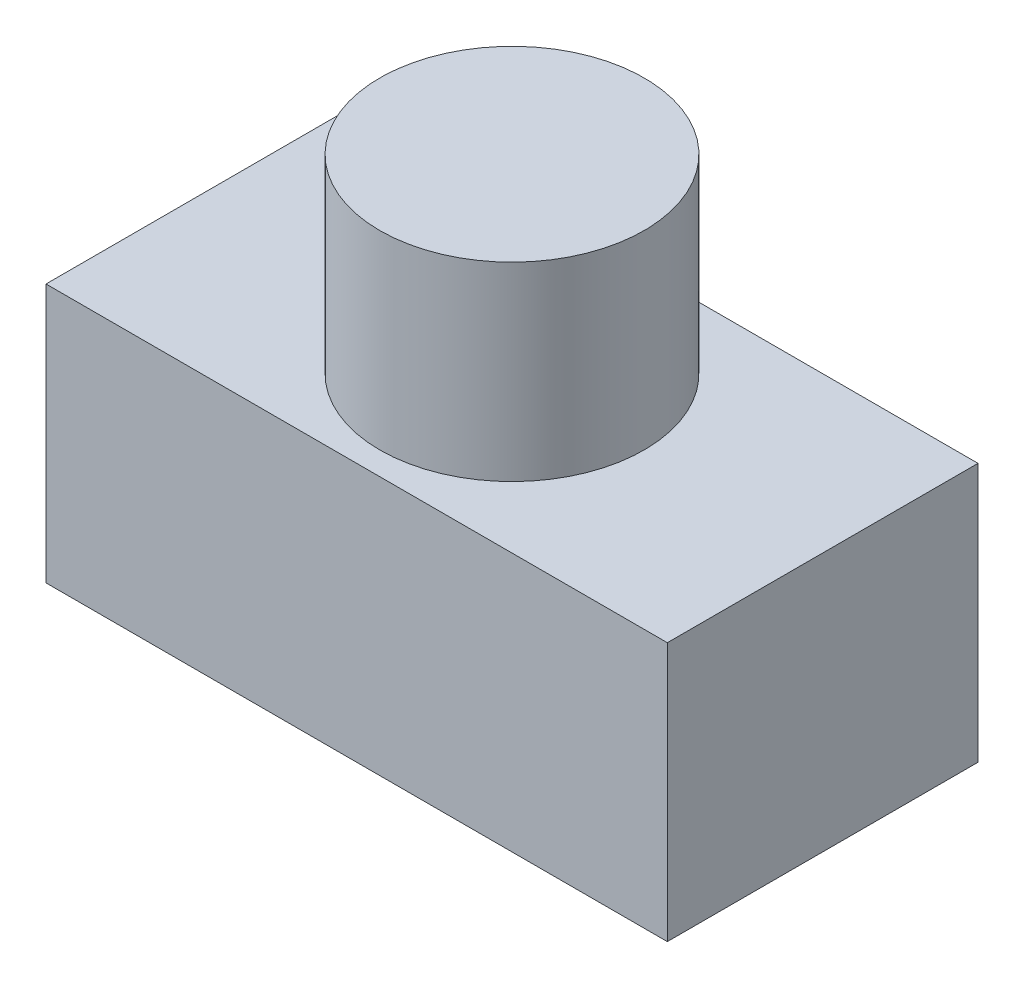
ISO-10303-21;
HEADER;
FILE_DESCRIPTION(('STEP AP214'),'2;1');
FILE_NAME('part.step','',(''),(''),'','','');
FILE_SCHEMA(('AUTOMOTIVE_DESIGN { 1 0 10303 214 1 1 1 1 }'));
ENDSEC;
DATA;
#1=APPLICATION_CONTEXT('core data for automotive mechanical design processes');
#2=APPLICATION_PROTOCOL_DEFINITION('international standard','automotive_design',2000,#1);
#3=PRODUCT_CONTEXT('',#1,'mechanical');
#4=PRODUCT('Part','Part','',(#3));
#5=PRODUCT_RELATED_PRODUCT_CATEGORY('part','',(#4));
#6=PRODUCT_DEFINITION_FORMATION('','',#4);
#7=PRODUCT_DEFINITION_CONTEXT('part definition',#1,'design');
#8=PRODUCT_DEFINITION('design','',#6,#7);
#9=PRODUCT_DEFINITION_SHAPE('','',#8);
#10=(LENGTH_UNIT() NAMED_UNIT(*) SI_UNIT(.MILLI.,.METRE.));
#11=(NAMED_UNIT(*) PLANE_ANGLE_UNIT() SI_UNIT($,.RADIAN.));
#12=(NAMED_UNIT(*) SI_UNIT($,.STERADIAN.) SOLID_ANGLE_UNIT());
#13=UNCERTAINTY_MEASURE_WITH_UNIT(LENGTH_MEASURE(1.E-05),#10,'distance_accuracy_value','');
#14=(GEOMETRIC_REPRESENTATION_CONTEXT(3) GLOBAL_UNCERTAINTY_ASSIGNED_CONTEXT((#13)) GLOBAL_UNIT_ASSIGNED_CONTEXT((#10,
#11,#12)) REPRESENTATION_CONTEXT('',''));
#15=CARTESIAN_POINT('',(0.,0.,0.));
#16=DIRECTION('',(0.,0.,1.));
#17=DIRECTION('',(1.,0.,0.));
#18=AXIS2_PLACEMENT_3D('',#15,#16,#17);
#19=CARTESIAN_POINT('',(152.4,-63.5,76.2));
#20=DIRECTION('',(-1.,0.,0.));
#21=DIRECTION('',(0.,0.,1.));
#22=AXIS2_PLACEMENT_3D('',#19,#20,#21);
#23=PLANE('',#22);
#24=DIRECTION('',(0.,1.,0.));
#25=VECTOR('',#24,1.);
#26=CARTESIAN_POINT('',(152.4,-63.5,-76.2));
#27=LINE('',#26,#25);
#28=CARTESIAN_POINT('',(152.4,-63.5,-76.2));
#29=VERTEX_POINT('',#28);
#30=CARTESIAN_POINT('',(152.4,63.5,-76.2));
#31=VERTEX_POINT('',#30);
#32=EDGE_CURVE('E103',#29,#31,#27,.T.);
#33=ORIENTED_EDGE('',*,*,#32,.T.);
#34=DIRECTION('',(0.,0.,-1.));
#35=VECTOR('',#34,1.);
#36=CARTESIAN_POINT('',(152.4,63.5,76.2));
#37=LINE('',#36,#35);
#38=CARTESIAN_POINT('',(152.4,63.5,76.2));
#39=VERTEX_POINT('',#38);
#40=EDGE_CURVE('E40',#39,#31,#37,.T.);
#41=ORIENTED_EDGE('',*,*,#40,.F.);
#42=DIRECTION('',(0.,1.,0.));
#43=VECTOR('',#42,1.);
#44=CARTESIAN_POINT('',(152.4,-63.5,76.2));
#45=LINE('',#44,#43);
#46=CARTESIAN_POINT('',(152.4,-63.5,76.2));
#47=VERTEX_POINT('',#46);
#48=EDGE_CURVE('E90',#47,#39,#45,.T.);
#49=ORIENTED_EDGE('',*,*,#48,.F.);
#50=DIRECTION('',(0.,0.,-1.));
#51=VECTOR('',#50,1.);
#52=CARTESIAN_POINT('',(152.4,-63.5,76.2));
#53=LINE('',#52,#51);
#54=EDGE_CURVE('E99',#47,#29,#53,.T.);
#55=ORIENTED_EDGE('',*,*,#54,.T.);
#56=EDGE_LOOP('',(#33,#41,#49,#55));
#57=FACE_BOUND('',#56,.T.);
#58=ADVANCED_FACE('F37',(#57),#23,.F.);
#59=CARTESIAN_POINT('',(-152.4,63.5,76.2));
#60=DIRECTION('',(0.,-1.,0.));
#61=DIRECTION('',(0.,0.,-1.));
#62=AXIS2_PLACEMENT_3D('',#59,#60,#61);
#63=PLANE('',#62);
#64=CARTESIAN_POINT('',(0.,63.5,0.));
#65=DIRECTION('',(0.,1.,0.));
#66=DIRECTION('',(0.,0.,1.));
#67=AXIS2_PLACEMENT_3D('',#64,#65,#66);
#68=CIRCLE('',#67,64.855004159496);
#69=CARTESIAN_POINT('',(0.,63.5,64.855004159496));
#70=VERTEX_POINT('',#69);
#71=EDGE_CURVE('E11',#70,#70,#68,.T.);
#72=ORIENTED_EDGE('',*,*,#71,.F.);
#73=EDGE_LOOP('',(#72));
#74=FACE_BOUND('',#73,.T.);
#75=DIRECTION('',(-1.,0.,0.));
#76=VECTOR('',#75,1.);
#77=CARTESIAN_POINT('',(-152.4,63.5,-76.2));
#78=LINE('',#77,#76);
#79=CARTESIAN_POINT('',(-152.4,63.5,-76.2));
#80=VERTEX_POINT('',#79);
#81=EDGE_CURVE('E95',#31,#80,#78,.T.);
#82=ORIENTED_EDGE('',*,*,#81,.T.);
#83=DIRECTION('',(0.,0.,-1.));
#84=VECTOR('',#83,1.);
#85=CARTESIAN_POINT('',(-152.4,63.5,76.2));
#86=LINE('',#85,#84);
#87=CARTESIAN_POINT('',(-152.4,63.5,76.2));
#88=VERTEX_POINT('',#87);
#89=EDGE_CURVE('E93',#88,#80,#86,.T.);
#90=ORIENTED_EDGE('',*,*,#89,.F.);
#91=DIRECTION('',(-1.,0.,0.));
#92=VECTOR('',#91,1.);
#93=CARTESIAN_POINT('',(-152.4,63.5,76.2));
#94=LINE('',#93,#92);
#95=EDGE_CURVE('E85',#39,#88,#94,.T.);
#96=ORIENTED_EDGE('',*,*,#95,.F.);
#97=ORIENTED_EDGE('',*,*,#40,.T.);
#98=EDGE_LOOP('',(#82,#90,#96,#97));
#99=FACE_BOUND('',#98,.T.);
#100=ADVANCED_FACE('F94',(#74,#99),#63,.F.);
#101=CARTESIAN_POINT('',(-152.4,-63.5,76.2));
#102=DIRECTION('',(1.,0.,0.));
#103=DIRECTION('',(0.,0.,-1.));
#104=AXIS2_PLACEMENT_3D('',#101,#102,#103);
#105=PLANE('',#104);
#106=DIRECTION('',(0.,-1.,0.));
#107=VECTOR('',#106,1.);
#108=CARTESIAN_POINT('',(-152.4,-63.5,-76.2));
#109=LINE('',#108,#107);
#110=CARTESIAN_POINT('',(-152.4,-63.5,-76.2));
#111=VERTEX_POINT('',#110);
#112=EDGE_CURVE('E71',#80,#111,#109,.T.);
#113=ORIENTED_EDGE('',*,*,#112,.T.);
#114=DIRECTION('',(0.,0.,-1.));
#115=VECTOR('',#114,1.);
#116=CARTESIAN_POINT('',(-152.4,-63.5,76.2));
#117=LINE('',#116,#115);
#118=CARTESIAN_POINT('',(-152.4,-63.5,76.2));
#119=VERTEX_POINT('',#118);
#120=EDGE_CURVE('E96',#119,#111,#117,.T.);
#121=ORIENTED_EDGE('',*,*,#120,.F.);
#122=DIRECTION('',(0.,-1.,0.));
#123=VECTOR('',#122,1.);
#124=CARTESIAN_POINT('',(-152.4,-63.5,76.2));
#125=LINE('',#124,#123);
#126=EDGE_CURVE('E88',#88,#119,#125,.T.);
#127=ORIENTED_EDGE('',*,*,#126,.F.);
#128=ORIENTED_EDGE('',*,*,#89,.T.);
#129=EDGE_LOOP('',(#113,#121,#127,#128));
#130=FACE_BOUND('',#129,.T.);
#131=ADVANCED_FACE('F97',(#130),#105,.F.);
#132=CARTESIAN_POINT('',(-152.4,-63.5,76.2));
#133=DIRECTION('',(0.,1.,0.));
#134=DIRECTION('',(0.,0.,1.));
#135=AXIS2_PLACEMENT_3D('',#132,#133,#134);
#136=PLANE('',#135);
#137=CARTESIAN_POINT('',(0.,-63.5,0.));
#138=DIRECTION('',(0.,1.,0.));
#139=DIRECTION('',(0.,0.,1.));
#140=AXIS2_PLACEMENT_3D('',#137,#138,#139);
#141=CIRCLE('',#140,46.9608561348397);
#142=CARTESIAN_POINT('',(0.,-63.5,46.9608561348397));
#143=VERTEX_POINT('',#142);
#144=EDGE_CURVE('E106',#143,#143,#141,.T.);
#145=ORIENTED_EDGE('',*,*,#144,.T.);
#146=EDGE_LOOP('',(#145));
#147=FACE_BOUND('',#146,.T.);
#148=DIRECTION('',(1.,0.,0.));
#149=VECTOR('',#148,1.);
#150=CARTESIAN_POINT('',(-152.4,-63.5,-76.2));
#151=LINE('',#150,#149);
#152=EDGE_CURVE('E77',#111,#29,#151,.T.);
#153=ORIENTED_EDGE('',*,*,#152,.T.);
#154=ORIENTED_EDGE('',*,*,#54,.F.);
#155=DIRECTION('',(1.,0.,0.));
#156=VECTOR('',#155,1.);
#157=CARTESIAN_POINT('',(-152.4,-63.5,76.2));
#158=LINE('',#157,#156);
#159=EDGE_CURVE('E54',#119,#47,#158,.T.);
#160=ORIENTED_EDGE('',*,*,#159,.F.);
#161=ORIENTED_EDGE('',*,*,#120,.T.);
#162=EDGE_LOOP('',(#153,#154,#160,#161));
#163=FACE_BOUND('',#162,.T.);
#164=ADVANCED_FACE('F111',(#147,#163),#136,.F.);
#165=CARTESIAN_POINT('',(0.,0.,76.2));
#166=DIRECTION('',(0.,0.,-1.));
#167=DIRECTION('',(-1.,0.,0.));
#168=AXIS2_PLACEMENT_3D('',#165,#166,#167);
#169=PLANE('',#168);
#170=ORIENTED_EDGE('',*,*,#48,.T.);
#171=ORIENTED_EDGE('',*,*,#95,.T.);
#172=ORIENTED_EDGE('',*,*,#126,.T.);
#173=ORIENTED_EDGE('',*,*,#159,.T.);
#174=EDGE_LOOP('',(#170,#171,#172,#173));
#175=FACE_BOUND('',#174,.T.);
#176=ADVANCED_FACE('F86',(#175),#169,.F.);
#177=CARTESIAN_POINT('',(0.,0.,-76.2));
#178=DIRECTION('',(0.,0.,-1.));
#179=DIRECTION('',(-1.,0.,0.));
#180=AXIS2_PLACEMENT_3D('',#177,#178,#179);
#181=PLANE('',#180);
#182=ORIENTED_EDGE('',*,*,#32,.F.);
#183=ORIENTED_EDGE('',*,*,#152,.F.);
#184=ORIENTED_EDGE('',*,*,#112,.F.);
#185=ORIENTED_EDGE('',*,*,#81,.F.);
#186=EDGE_LOOP('',(#182,#183,#184,#185));
#187=FACE_BOUND('',#186,.T.);
#188=ADVANCED_FACE('F114',(#187),#181,.T.);
#189=CARTESIAN_POINT('',(0.,-63.5,0.));
#190=DIRECTION('',(0.,1.,0.));
#191=DIRECTION('',(0.,0.,1.));
#192=AXIS2_PLACEMENT_3D('',#189,#190,#191);
#193=CYLINDRICAL_SURFACE('',#192,46.9608561348397);
#194=ORIENTED_EDGE('',*,*,#144,.F.);
#195=EDGE_LOOP('',(#194));
#196=FACE_BOUND('',#195,.T.);
#197=CARTESIAN_POINT('',(0.,63.5,0.));
#198=DIRECTION('',(0.,1.,0.));
#199=DIRECTION('',(0.,0.,1.));
#200=AXIS2_PLACEMENT_3D('',#197,#198,#199);
#201=CIRCLE('',#200,46.9608561348397);
#202=CARTESIAN_POINT('',(0.,63.5,46.9608561348397));
#203=VERTEX_POINT('',#202);
#204=EDGE_CURVE('E117',#203,#203,#201,.T.);
#205=ORIENTED_EDGE('',*,*,#204,.T.);
#206=EDGE_LOOP('',(#205));
#207=FACE_BOUND('',#206,.T.);
#208=ADVANCED_FACE('F147',(#196,#207),#193,.F.);
#209=CARTESIAN_POINT('',(0.,156.718,0.));
#210=DIRECTION('',(0.,1.,0.));
#211=DIRECTION('',(0.,0.,1.));
#212=AXIS2_PLACEMENT_3D('',#209,#210,#211);
#213=PLANE('',#212);
#214=CARTESIAN_POINT('',(0.,156.718,0.));
#215=DIRECTION('',(0.,1.,0.));
#216=DIRECTION('',(0.,0.,1.));
#217=AXIS2_PLACEMENT_3D('',#214,#215,#216);
#218=CIRCLE('',#217,64.855004159496);
#219=CARTESIAN_POINT('',(0.,156.718,64.855004159496));
#220=VERTEX_POINT('',#219);
#221=EDGE_CURVE('E120',#220,#220,#218,.T.);
#222=ORIENTED_EDGE('',*,*,#221,.T.);
#223=EDGE_LOOP('',(#222));
#224=FACE_BOUND('',#223,.T.);
#225=ADVANCED_FACE('F126',(#224),#213,.T.);
#226=CARTESIAN_POINT('',(0.,156.718,0.));
#227=DIRECTION('',(0.,-1.,0.));
#228=DIRECTION('',(0.,0.,-1.));
#229=AXIS2_PLACEMENT_3D('',#226,#227,#228);
#230=CYLINDRICAL_SURFACE('',#229,64.855004159496);
#231=ORIENTED_EDGE('',*,*,#221,.F.);
#232=EDGE_LOOP('',(#231));
#233=FACE_BOUND('',#232,.T.);
#234=ORIENTED_EDGE('',*,*,#71,.T.);
#235=EDGE_LOOP('',(#234));
#236=FACE_BOUND('',#235,.T.);
#237=ADVANCED_FACE('F128',(#233,#236),#230,.T.);
#238=CARTESIAN_POINT('',(0.,63.5,0.));
#239=DIRECTION('',(0.,1.,0.));
#240=DIRECTION('',(0.,0.,1.));
#241=AXIS2_PLACEMENT_3D('',#238,#239,#240);
#242=PLANE('',#241);
#243=ORIENTED_EDGE('',*,*,#204,.F.);
#244=EDGE_LOOP('',(#243));
#245=FACE_BOUND('',#244,.T.);
#246=ADVANCED_FACE('F131',(#245),#242,.F.);
#247=CLOSED_SHELL('',(#58,#100,#131,#164,#176,#188,#208,#225,#237,#246));
#248=MANIFOLD_SOLID_BREP('B2',#247);
#249=ADVANCED_BREP_SHAPE_REPRESENTATION('',(#18,#248),#14);
#250=SHAPE_DEFINITION_REPRESENTATION(#9,#249);
ENDSEC;
END-ISO-10303-21;
